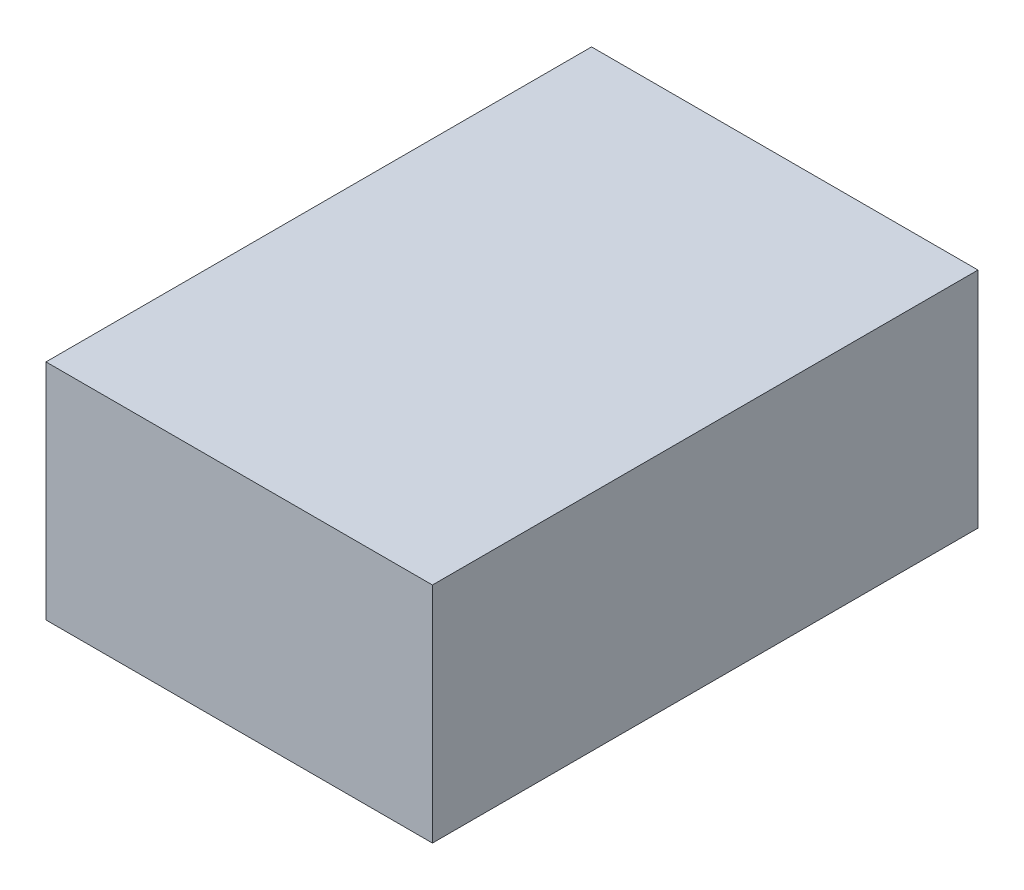
ISO-10303-21;
HEADER;
FILE_DESCRIPTION(('STEP AP214'),'2;1');
FILE_NAME('part.step','',(''),(''),'','','');
FILE_SCHEMA(('AUTOMOTIVE_DESIGN { 1 0 10303 214 1 1 1 1 }'));
ENDSEC;
DATA;
#1=APPLICATION_CONTEXT('core data for automotive mechanical design processes');
#2=APPLICATION_PROTOCOL_DEFINITION('international standard','automotive_design',2000,#1);
#3=PRODUCT_CONTEXT('',#1,'mechanical');
#4=PRODUCT('Part','Part','',(#3));
#5=PRODUCT_RELATED_PRODUCT_CATEGORY('part','',(#4));
#6=PRODUCT_DEFINITION_FORMATION('','',#4);
#7=PRODUCT_DEFINITION_CONTEXT('part definition',#1,'design');
#8=PRODUCT_DEFINITION('design','',#6,#7);
#9=PRODUCT_DEFINITION_SHAPE('','',#8);
#10=(LENGTH_UNIT() NAMED_UNIT(*) SI_UNIT(.MILLI.,.METRE.));
#11=(NAMED_UNIT(*) PLANE_ANGLE_UNIT() SI_UNIT($,.RADIAN.));
#12=(NAMED_UNIT(*) SI_UNIT($,.STERADIAN.) SOLID_ANGLE_UNIT());
#13=UNCERTAINTY_MEASURE_WITH_UNIT(LENGTH_MEASURE(1.E-05),#10,'distance_accuracy_value','');
#14=(GEOMETRIC_REPRESENTATION_CONTEXT(3) GLOBAL_UNCERTAINTY_ASSIGNED_CONTEXT((#13)) GLOBAL_UNIT_ASSIGNED_CONTEXT((#10,
#11,#12)) REPRESENTATION_CONTEXT('',''));
#15=CARTESIAN_POINT('',(0.,0.,0.));
#16=DIRECTION('',(0.,0.,1.));
#17=DIRECTION('',(1.,0.,0.));
#18=AXIS2_PLACEMENT_3D('',#15,#16,#17);
#19=CARTESIAN_POINT('',(5.1,5.9,7.2));
#20=DIRECTION('',(-1.,0.,0.));
#21=DIRECTION('',(0.,0.,1.));
#22=AXIS2_PLACEMENT_3D('',#19,#20,#21);
#23=PLANE('',#22);
#24=DIRECTION('',(0.,0.,-1.));
#25=VECTOR('',#24,1.);
#26=CARTESIAN_POINT('',(5.1,0.,7.2));
#27=LINE('',#26,#25);
#28=CARTESIAN_POINT('',(5.1,0.,7.2));
#29=VERTEX_POINT('',#28);
#30=CARTESIAN_POINT('',(5.1,0.,-7.2));
#31=VERTEX_POINT('',#30);
#32=EDGE_CURVE('E91',#29,#31,#27,.T.);
#33=ORIENTED_EDGE('',*,*,#32,.T.);
#34=DIRECTION('',(0.,-1.,0.));
#35=VECTOR('',#34,1.);
#36=CARTESIAN_POINT('',(5.1,5.9,-7.2));
#37=LINE('',#36,#35);
#38=CARTESIAN_POINT('',(5.1,5.9,-7.2));
#39=VERTEX_POINT('',#38);
#40=EDGE_CURVE('E11',#39,#31,#37,.T.);
#41=ORIENTED_EDGE('',*,*,#40,.F.);
#42=DIRECTION('',(0.,0.,-1.));
#43=VECTOR('',#42,1.);
#44=CARTESIAN_POINT('',(5.1,5.9,7.2));
#45=LINE('',#44,#43);
#46=CARTESIAN_POINT('',(5.1,5.9,7.2));
#47=VERTEX_POINT('',#46);
#48=EDGE_CURVE('E79',#47,#39,#45,.T.);
#49=ORIENTED_EDGE('',*,*,#48,.F.);
#50=DIRECTION('',(0.,-1.,0.));
#51=VECTOR('',#50,1.);
#52=CARTESIAN_POINT('',(5.1,5.9,7.2));
#53=LINE('',#52,#51);
#54=EDGE_CURVE('E87',#47,#29,#53,.T.);
#55=ORIENTED_EDGE('',*,*,#54,.T.);
#56=EDGE_LOOP('',(#33,#41,#49,#55));
#57=FACE_BOUND('',#56,.T.);
#58=ADVANCED_FACE('F28',(#57),#23,.F.);
#59=CARTESIAN_POINT('',(-5.1,5.9,-7.2));
#60=DIRECTION('',(0.,0.,1.));
#61=DIRECTION('',(1.,0.,0.));
#62=AXIS2_PLACEMENT_3D('',#59,#60,#61);
#63=PLANE('',#62);
#64=DIRECTION('',(-1.,0.,0.));
#65=VECTOR('',#64,1.);
#66=CARTESIAN_POINT('',(-5.1,0.,-7.2));
#67=LINE('',#66,#65);
#68=CARTESIAN_POINT('',(-5.1,0.,-7.2));
#69=VERTEX_POINT('',#68);
#70=EDGE_CURVE('E83',#31,#69,#67,.T.);
#71=ORIENTED_EDGE('',*,*,#70,.T.);
#72=DIRECTION('',(0.,-1.,0.));
#73=VECTOR('',#72,1.);
#74=CARTESIAN_POINT('',(-5.1,5.9,-7.2));
#75=LINE('',#74,#73);
#76=CARTESIAN_POINT('',(-5.1,5.9,-7.2));
#77=VERTEX_POINT('',#76);
#78=EDGE_CURVE('E36',#77,#69,#75,.T.);
#79=ORIENTED_EDGE('',*,*,#78,.F.);
#80=DIRECTION('',(-1.,0.,0.));
#81=VECTOR('',#80,1.);
#82=CARTESIAN_POINT('',(-5.1,5.9,-7.2));
#83=LINE('',#82,#81);
#84=EDGE_CURVE('E74',#39,#77,#83,.T.);
#85=ORIENTED_EDGE('',*,*,#84,.F.);
#86=ORIENTED_EDGE('',*,*,#40,.T.);
#87=EDGE_LOOP('',(#71,#79,#85,#86));
#88=FACE_BOUND('',#87,.T.);
#89=ADVANCED_FACE('F82',(#88),#63,.F.);
#90=CARTESIAN_POINT('',(-5.1,5.9,7.2));
#91=DIRECTION('',(1.,0.,0.));
#92=DIRECTION('',(0.,0.,-1.));
#93=AXIS2_PLACEMENT_3D('',#90,#91,#92);
#94=PLANE('',#93);
#95=DIRECTION('',(0.,0.,1.));
#96=VECTOR('',#95,1.);
#97=CARTESIAN_POINT('',(-5.1,0.,7.2));
#98=LINE('',#97,#96);
#99=CARTESIAN_POINT('',(-5.1,0.,7.2));
#100=VERTEX_POINT('',#99);
#101=EDGE_CURVE('E61',#69,#100,#98,.T.);
#102=ORIENTED_EDGE('',*,*,#101,.T.);
#103=DIRECTION('',(0.,-1.,0.));
#104=VECTOR('',#103,1.);
#105=CARTESIAN_POINT('',(-5.1,5.9,7.2));
#106=LINE('',#105,#104);
#107=CARTESIAN_POINT('',(-5.1,5.9,7.2));
#108=VERTEX_POINT('',#107);
#109=EDGE_CURVE('E84',#108,#100,#106,.T.);
#110=ORIENTED_EDGE('',*,*,#109,.F.);
#111=DIRECTION('',(0.,0.,1.));
#112=VECTOR('',#111,1.);
#113=CARTESIAN_POINT('',(-5.1,5.9,7.2));
#114=LINE('',#113,#112);
#115=EDGE_CURVE('E77',#77,#108,#114,.T.);
#116=ORIENTED_EDGE('',*,*,#115,.F.);
#117=ORIENTED_EDGE('',*,*,#78,.T.);
#118=EDGE_LOOP('',(#102,#110,#116,#117));
#119=FACE_BOUND('',#118,.T.);
#120=ADVANCED_FACE('F85',(#119),#94,.F.);
#121=CARTESIAN_POINT('',(-5.1,5.9,7.2));
#122=DIRECTION('',(0.,0.,-1.));
#123=DIRECTION('',(-1.,0.,0.));
#124=AXIS2_PLACEMENT_3D('',#121,#122,#123);
#125=PLANE('',#124);
#126=DIRECTION('',(1.,0.,0.));
#127=VECTOR('',#126,1.);
#128=CARTESIAN_POINT('',(-5.1,0.,7.2));
#129=LINE('',#128,#127);
#130=EDGE_CURVE('E67',#100,#29,#129,.T.);
#131=ORIENTED_EDGE('',*,*,#130,.T.);
#132=ORIENTED_EDGE('',*,*,#54,.F.);
#133=DIRECTION('',(1.,0.,0.));
#134=VECTOR('',#133,1.);
#135=CARTESIAN_POINT('',(-5.1,5.9,7.2));
#136=LINE('',#135,#134);
#137=EDGE_CURVE('E44',#108,#47,#136,.T.);
#138=ORIENTED_EDGE('',*,*,#137,.F.);
#139=ORIENTED_EDGE('',*,*,#109,.T.);
#140=EDGE_LOOP('',(#131,#132,#138,#139));
#141=FACE_BOUND('',#140,.T.);
#142=ADVANCED_FACE('F98',(#141),#125,.F.);
#143=CARTESIAN_POINT('',(0.,5.9,0.));
#144=DIRECTION('',(0.,-1.,0.));
#145=DIRECTION('',(0.,0.,-1.));
#146=AXIS2_PLACEMENT_3D('',#143,#144,#145);
#147=PLANE('',#146);
#148=ORIENTED_EDGE('',*,*,#48,.T.);
#149=ORIENTED_EDGE('',*,*,#84,.T.);
#150=ORIENTED_EDGE('',*,*,#115,.T.);
#151=ORIENTED_EDGE('',*,*,#137,.T.);
#152=EDGE_LOOP('',(#148,#149,#150,#151));
#153=FACE_BOUND('',#152,.T.);
#154=ADVANCED_FACE('F75',(#153),#147,.F.);
#155=CARTESIAN_POINT('',(0.,0.,0.));
#156=DIRECTION('',(0.,-1.,0.));
#157=DIRECTION('',(0.,0.,-1.));
#158=AXIS2_PLACEMENT_3D('',#155,#156,#157);
#159=PLANE('',#158);
#160=ORIENTED_EDGE('',*,*,#32,.F.);
#161=ORIENTED_EDGE('',*,*,#130,.F.);
#162=ORIENTED_EDGE('',*,*,#101,.F.);
#163=ORIENTED_EDGE('',*,*,#70,.F.);
#164=EDGE_LOOP('',(#160,#161,#162,#163));
#165=FACE_BOUND('',#164,.T.);
#166=ADVANCED_FACE('F101',(#165),#159,.T.);
#167=CLOSED_SHELL('',(#58,#89,#120,#142,#154,#166));
#168=MANIFOLD_SOLID_BREP('B2',#167);
#169=ADVANCED_BREP_SHAPE_REPRESENTATION('',(#18,#168),#14);
#170=SHAPE_DEFINITION_REPRESENTATION(#9,#169);
ENDSEC;
END-ISO-10303-21;
